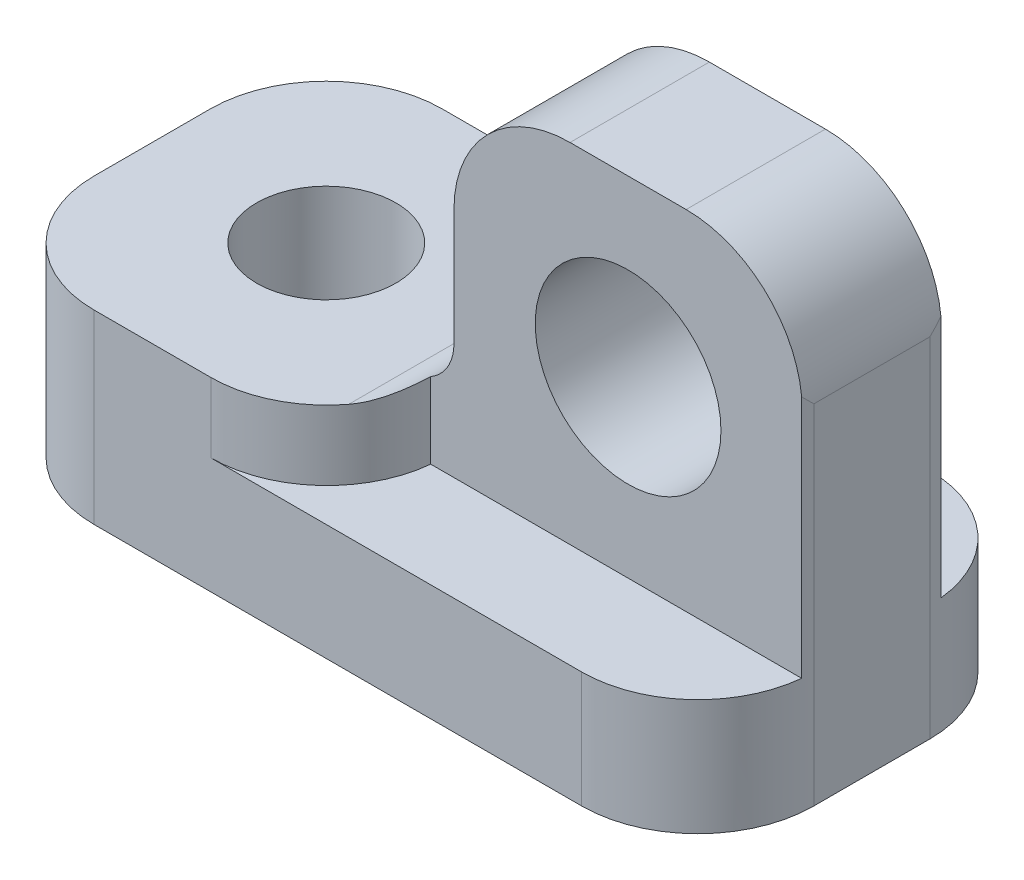
ISO-10303-21;
HEADER;
FILE_DESCRIPTION(('STEP AP214'),'2;1');
FILE_NAME('part.step','',(''),(''),'','','');
FILE_SCHEMA(('AUTOMOTIVE_DESIGN { 1 0 10303 214 1 1 1 1 }'));
ENDSEC;
DATA;
#1=APPLICATION_CONTEXT('core data for automotive mechanical design processes');
#2=APPLICATION_PROTOCOL_DEFINITION('international standard','automotive_design',2000,#1);
#3=PRODUCT_CONTEXT('',#1,'mechanical');
#4=PRODUCT('Part','Part','',(#3));
#5=PRODUCT_RELATED_PRODUCT_CATEGORY('part','',(#4));
#6=PRODUCT_DEFINITION_FORMATION('','',#4);
#7=PRODUCT_DEFINITION_CONTEXT('part definition',#1,'design');
#8=PRODUCT_DEFINITION('design','',#6,#7);
#9=PRODUCT_DEFINITION_SHAPE('','',#8);
#10=(LENGTH_UNIT() NAMED_UNIT(*) SI_UNIT(.MILLI.,.METRE.));
#11=(NAMED_UNIT(*) PLANE_ANGLE_UNIT() SI_UNIT($,.RADIAN.));
#12=(NAMED_UNIT(*) SI_UNIT($,.STERADIAN.) SOLID_ANGLE_UNIT());
#13=UNCERTAINTY_MEASURE_WITH_UNIT(LENGTH_MEASURE(1.E-05),#10,'distance_accuracy_value','');
#14=(GEOMETRIC_REPRESENTATION_CONTEXT(3) GLOBAL_UNCERTAINTY_ASSIGNED_CONTEXT((#13)) GLOBAL_UNIT_ASSIGNED_CONTEXT((#10,
#11,#12)) REPRESENTATION_CONTEXT('',''));
#15=CARTESIAN_POINT('',(0.,0.,0.));
#16=DIRECTION('',(0.,0.,1.));
#17=DIRECTION('',(1.,0.,0.));
#18=AXIS2_PLACEMENT_3D('',#15,#16,#17);
#19=CARTESIAN_POINT('',(0.,5.,0.));
#20=DIRECTION('',(0.,-1.,0.));
#21=DIRECTION('',(0.,0.,-1.));
#22=AXIS2_PLACEMENT_3D('',#19,#20,#21);
#23=PLANE('',#22);
#24=DIRECTION('',(-1.,0.,0.));
#25=VECTOR('',#24,1.);
#26=CARTESIAN_POINT('',(16.,5.,-10.5));
#27=LINE('',#26,#25);
#28=CARTESIAN_POINT('',(30.9749371855331,5.,-10.5));
#29=VERTEX_POINT('',#28);
#30=CARTESIAN_POINT('',(15.,5.,-10.5));
#31=VERTEX_POINT('',#30);
#32=EDGE_CURVE('E187',#29,#31,#27,.T.);
#33=ORIENTED_EDGE('',*,*,#32,.F.);
#34=CARTESIAN_POINT('',(26.,5.,-10.));
#35=DIRECTION('',(0.,-1.,0.));
#36=DIRECTION('',(0.,0.,-1.));
#37=AXIS2_PLACEMENT_3D('',#34,#35,#36);
#38=CIRCLE('',#37,5.);
#39=CARTESIAN_POINT('',(26.,5.,-15.));
#40=VERTEX_POINT('',#39);
#41=EDGE_CURVE('E283',#29,#40,#38,.F.);
#42=ORIENTED_EDGE('',*,*,#41,.T.);
#43=DIRECTION('',(-1.,0.,0.));
#44=VECTOR('',#43,1.);
#45=CARTESIAN_POINT('',(0.,5.,-15.));
#46=LINE('',#45,#44);
#47=CARTESIAN_POINT('',(10.0250628144669,5.,-15.));
#48=VERTEX_POINT('',#47);
#49=EDGE_CURVE('E231',#40,#48,#46,.T.);
#50=ORIENTED_EDGE('',*,*,#49,.T.);
#51=CARTESIAN_POINT('',(10.0250628144669,5.,-10.));
#52=DIRECTION('',(0.,-1.,0.));
#53=DIRECTION('',(0.,0.,-1.));
#54=AXIS2_PLACEMENT_3D('',#51,#52,#53);
#55=CIRCLE('',#54,5.);
#56=EDGE_CURVE('E178',#48,#31,#55,.T.);
#57=ORIENTED_EDGE('',*,*,#56,.T.);
#58=EDGE_LOOP('',(#33,#42,#50,#57));
#59=FACE_BOUND('',#58,.T.);
#60=ADVANCED_FACE('F35',(#59),#23,.F.);
#61=DIRECTION('',(1.,0.,0.));
#62=VECTOR('',#61,1.);
#63=CARTESIAN_POINT('',(0.,5.,0.));
#64=LINE('',#63,#62);
#65=CARTESIAN_POINT('',(10.0250628144669,5.,0.));
#66=VERTEX_POINT('',#65);
#67=CARTESIAN_POINT('',(26.,5.,0.));
#68=VERTEX_POINT('',#67);
#69=EDGE_CURVE('E229',#66,#68,#64,.T.);
#70=ORIENTED_EDGE('',*,*,#69,.T.);
#71=CARTESIAN_POINT('',(26.,5.,-5.));
#72=DIRECTION('',(0.,-1.,0.));
#73=DIRECTION('',(0.,0.,-1.));
#74=AXIS2_PLACEMENT_3D('',#71,#72,#73);
#75=CIRCLE('',#74,5.);
#76=CARTESIAN_POINT('',(30.9749371855331,5.,-4.5));
#77=VERTEX_POINT('',#76);
#78=EDGE_CURVE('E184',#68,#77,#75,.F.);
#79=ORIENTED_EDGE('',*,*,#78,.T.);
#80=DIRECTION('',(1.,0.,0.));
#81=VECTOR('',#80,1.);
#82=CARTESIAN_POINT('',(16.,5.,-4.5));
#83=LINE('',#82,#81);
#84=CARTESIAN_POINT('',(15.,5.,-4.5));
#85=VERTEX_POINT('',#84);
#86=EDGE_CURVE('E181',#85,#77,#83,.T.);
#87=ORIENTED_EDGE('',*,*,#86,.F.);
#88=CARTESIAN_POINT('',(10.0250628144669,5.,-5.));
#89=DIRECTION('',(0.,-1.,0.));
#90=DIRECTION('',(0.,0.,-1.));
#91=AXIS2_PLACEMENT_3D('',#88,#89,#90);
#92=CIRCLE('',#91,5.);
#93=EDGE_CURVE('E170',#85,#66,#92,.T.);
#94=ORIENTED_EDGE('',*,*,#93,.T.);
#95=EDGE_LOOP('',(#70,#79,#87,#94));
#96=FACE_BOUND('',#95,.T.);
#97=ADVANCED_FACE('F182',(#96),#23,.F.);
#98=CARTESIAN_POINT('',(16.,20.,-10.5));
#99=DIRECTION('',(1.,0.,0.));
#100=DIRECTION('',(0.,0.,-1.));
#101=AXIS2_PLACEMENT_3D('',#98,#99,#100);
#102=PLANE('',#101);
#103=DIRECTION('',(0.,-1.,0.));
#104=VECTOR('',#103,1.);
#105=CARTESIAN_POINT('',(16.,20.,-10.5));
#106=LINE('',#105,#104);
#107=CARTESIAN_POINT('',(16.,15.,-10.5));
#108=VERTEX_POINT('',#107);
#109=CARTESIAN_POINT('',(16.,10.,-10.5));
#110=VERTEX_POINT('',#109);
#111=EDGE_CURVE('E207',#108,#110,#106,.T.);
#112=ORIENTED_EDGE('',*,*,#111,.T.);
#113=DIRECTION('',(0.,0.,-1.));
#114=VECTOR('',#113,1.);
#115=CARTESIAN_POINT('',(16.,10.,-10.5));
#116=LINE('',#115,#114);
#117=CARTESIAN_POINT('',(16.,10.,-4.5));
#118=VERTEX_POINT('',#117);
#119=EDGE_CURVE('E311',#110,#118,#116,.F.);
#120=ORIENTED_EDGE('',*,*,#119,.T.);
#121=DIRECTION('',(0.,-1.,0.));
#122=VECTOR('',#121,1.);
#123=CARTESIAN_POINT('',(16.,20.,-4.5));
#124=LINE('',#123,#122);
#125=CARTESIAN_POINT('',(16.,15.,-4.5));
#126=VERTEX_POINT('',#125);
#127=EDGE_CURVE('E212',#126,#118,#124,.T.);
#128=ORIENTED_EDGE('',*,*,#127,.F.);
#129=DIRECTION('',(0.,0.,1.));
#130=VECTOR('',#129,1.);
#131=CARTESIAN_POINT('',(16.,15.,-10.5));
#132=LINE('',#131,#130);
#133=EDGE_CURVE('E253',#126,#108,#132,.F.);
#134=ORIENTED_EDGE('',*,*,#133,.T.);
#135=EDGE_LOOP('',(#112,#120,#128,#134));
#136=FACE_BOUND('',#135,.T.);
#137=ADVANCED_FACE('F347',(#136),#102,.F.);
#138=CARTESIAN_POINT('',(0.,5.,0.));
#139=DIRECTION('',(1.,0.,0.));
#140=DIRECTION('',(0.,0.,-1.));
#141=AXIS2_PLACEMENT_3D('',#138,#139,#140);
#142=PLANE('',#141);
#143=DIRECTION('',(0.,0.,1.));
#144=VECTOR('',#143,1.);
#145=CARTESIAN_POINT('',(0.,0.,0.));
#146=LINE('',#145,#144);
#147=CARTESIAN_POINT('',(0.,0.,-10.));
#148=VERTEX_POINT('',#147);
#149=CARTESIAN_POINT('',(0.,0.,-5.));
#150=VERTEX_POINT('',#149);
#151=EDGE_CURVE('E223',#148,#150,#146,.T.);
#152=ORIENTED_EDGE('',*,*,#151,.T.);
#153=DIRECTION('',(0.,-1.,0.));
#154=VECTOR('',#153,1.);
#155=CARTESIAN_POINT('',(0.,5.,-5.));
#156=LINE('',#155,#154);
#157=CARTESIAN_POINT('',(0.,8.,-5.));
#158=VERTEX_POINT('',#157);
#159=EDGE_CURVE('E306',#150,#158,#156,.F.);
#160=ORIENTED_EDGE('',*,*,#159,.T.);
#161=DIRECTION('',(0.,0.,1.));
#162=VECTOR('',#161,1.);
#163=CARTESIAN_POINT('',(0.,8.,-15.));
#164=LINE('',#163,#162);
#165=CARTESIAN_POINT('',(0.,8.,-10.));
#166=VERTEX_POINT('',#165);
#167=EDGE_CURVE('E214',#166,#158,#164,.T.);
#168=ORIENTED_EDGE('',*,*,#167,.F.);
#169=DIRECTION('',(0.,-1.,0.));
#170=VECTOR('',#169,1.);
#171=CARTESIAN_POINT('',(0.,5.,-10.));
#172=LINE('',#171,#170);
#173=EDGE_CURVE('E303',#166,#148,#172,.T.);
#174=ORIENTED_EDGE('',*,*,#173,.T.);
#175=EDGE_LOOP('',(#152,#160,#168,#174));
#176=FACE_BOUND('',#175,.T.);
#177=ADVANCED_FACE('F368',(#176),#142,.F.);
#178=CARTESIAN_POINT('',(0.,5.,0.));
#179=DIRECTION('',(0.,0.,-1.));
#180=DIRECTION('',(-1.,0.,0.));
#181=AXIS2_PLACEMENT_3D('',#178,#179,#180);
#182=PLANE('',#181);
#183=DIRECTION('',(1.,0.,0.));
#184=VECTOR('',#183,1.);
#185=CARTESIAN_POINT('',(0.,0.,0.));
#186=LINE('',#185,#184);
#187=CARTESIAN_POINT('',(5.,0.,0.));
#188=VERTEX_POINT('',#187);
#189=CARTESIAN_POINT('',(26.,0.,0.));
#190=VERTEX_POINT('',#189);
#191=EDGE_CURVE('E419',#188,#190,#186,.T.);
#192=ORIENTED_EDGE('',*,*,#191,.T.);
#193=DIRECTION('',(0.,-1.,0.));
#194=VECTOR('',#193,1.);
#195=CARTESIAN_POINT('',(26.,5.,0.));
#196=LINE('',#195,#194);
#197=EDGE_CURVE('E289',#190,#68,#196,.F.);
#198=ORIENTED_EDGE('',*,*,#197,.T.);
#199=ORIENTED_EDGE('',*,*,#69,.F.);
#200=DIRECTION('',(0.,-1.,0.));
#201=VECTOR('',#200,1.);
#202=CARTESIAN_POINT('',(10.0250628144669,5.,0.));
#203=LINE('',#202,#201);
#204=CARTESIAN_POINT('',(10.0250628144669,8.,0.));
#205=VERTEX_POINT('',#204);
#206=EDGE_CURVE('E174',#66,#205,#203,.F.);
#207=ORIENTED_EDGE('',*,*,#206,.T.);
#208=DIRECTION('',(1.,0.,0.));
#209=VECTOR('',#208,1.);
#210=CARTESIAN_POINT('',(0.,8.,0.));
#211=LINE('',#210,#209);
#212=CARTESIAN_POINT('',(5.,8.,0.));
#213=VERTEX_POINT('',#212);
#214=EDGE_CURVE('E217',#213,#205,#211,.T.);
#215=ORIENTED_EDGE('',*,*,#214,.F.);
#216=DIRECTION('',(0.,-1.,0.));
#217=VECTOR('',#216,1.);
#218=CARTESIAN_POINT('',(5.,5.,0.));
#219=LINE('',#218,#217);
#220=EDGE_CURVE('E285',#213,#188,#219,.T.);
#221=ORIENTED_EDGE('',*,*,#220,.T.);
#222=EDGE_LOOP('',(#192,#198,#199,#207,#215,#221));
#223=FACE_BOUND('',#222,.T.);
#224=ADVANCED_FACE('F364',(#223),#182,.F.);
#225=CARTESIAN_POINT('',(31.,5.,0.));
#226=DIRECTION('',(-1.,0.,0.));
#227=DIRECTION('',(0.,0.,1.));
#228=AXIS2_PLACEMENT_3D('',#225,#226,#227);
#229=PLANE('',#228);
#230=DIRECTION('',(0.,0.,-1.));
#231=VECTOR('',#230,1.);
#232=CARTESIAN_POINT('',(31.,0.,0.));
#233=LINE('',#232,#231);
#234=CARTESIAN_POINT('',(31.,0.,-5.));
#235=VERTEX_POINT('',#234);
#236=CARTESIAN_POINT('',(31.,0.,-10.));
#237=VERTEX_POINT('',#236);
#238=EDGE_CURVE('E422',#235,#237,#233,.T.);
#239=ORIENTED_EDGE('',*,*,#238,.T.);
#240=DIRECTION('',(0.,-1.,0.));
#241=VECTOR('',#240,1.);
#242=CARTESIAN_POINT('',(31.,5.,-10.));
#243=LINE('',#242,#241);
#244=CARTESIAN_POINT('',(31.,15.,-10.));
#245=VERTEX_POINT('',#244);
#246=EDGE_CURVE('E275',#237,#245,#243,.F.);
#247=ORIENTED_EDGE('',*,*,#246,.T.);
#248=DIRECTION('',(0.,0.,-1.));
#249=VECTOR('',#248,1.);
#250=CARTESIAN_POINT('',(31.,15.,-4.5));
#251=LINE('',#250,#249);
#252=CARTESIAN_POINT('',(31.,15.,-5.));
#253=VERTEX_POINT('',#252);
#254=EDGE_CURVE('E246',#245,#253,#251,.F.);
#255=ORIENTED_EDGE('',*,*,#254,.T.);
#256=DIRECTION('',(0.,-1.,0.));
#257=VECTOR('',#256,1.);
#258=CARTESIAN_POINT('',(31.,5.,-5.));
#259=LINE('',#258,#257);
#260=EDGE_CURVE('E272',#253,#235,#259,.T.);
#261=ORIENTED_EDGE('',*,*,#260,.T.);
#262=EDGE_LOOP('',(#239,#247,#255,#261));
#263=FACE_BOUND('',#262,.T.);
#264=ADVANCED_FACE('F360',(#263),#229,.F.);
#265=CARTESIAN_POINT('',(0.,5.,-15.));
#266=DIRECTION('',(0.,0.,1.));
#267=DIRECTION('',(1.,0.,0.));
#268=AXIS2_PLACEMENT_3D('',#265,#266,#267);
#269=PLANE('',#268);
#270=ORIENTED_EDGE('',*,*,#49,.F.);
#271=DIRECTION('',(0.,-1.,0.));
#272=VECTOR('',#271,1.);
#273=CARTESIAN_POINT('',(26.,5.,-15.));
#274=LINE('',#273,#272);
#275=CARTESIAN_POINT('',(26.,0.,-15.));
#276=VERTEX_POINT('',#275);
#277=EDGE_CURVE('E261',#40,#276,#274,.T.);
#278=ORIENTED_EDGE('',*,*,#277,.T.);
#279=DIRECTION('',(-1.,0.,0.));
#280=VECTOR('',#279,1.);
#281=CARTESIAN_POINT('',(0.,0.,-15.));
#282=LINE('',#281,#280);
#283=CARTESIAN_POINT('',(5.,0.,-15.));
#284=VERTEX_POINT('',#283);
#285=EDGE_CURVE('E232',#276,#284,#282,.T.);
#286=ORIENTED_EDGE('',*,*,#285,.T.);
#287=DIRECTION('',(0.,-1.,0.));
#288=VECTOR('',#287,1.);
#289=CARTESIAN_POINT('',(5.,5.,-15.));
#290=LINE('',#289,#288);
#291=CARTESIAN_POINT('',(5.,8.,-15.));
#292=VERTEX_POINT('',#291);
#293=EDGE_CURVE('E255',#284,#292,#290,.F.);
#294=ORIENTED_EDGE('',*,*,#293,.T.);
#295=DIRECTION('',(-1.,0.,0.));
#296=VECTOR('',#295,1.);
#297=CARTESIAN_POINT('',(0.,8.,-15.));
#298=LINE('',#297,#296);
#299=CARTESIAN_POINT('',(10.0250628144669,8.,-15.));
#300=VERTEX_POINT('',#299);
#301=EDGE_CURVE('E220',#300,#292,#298,.T.);
#302=ORIENTED_EDGE('',*,*,#301,.F.);
#303=DIRECTION('',(0.,1.,0.));
#304=VECTOR('',#303,1.);
#305=CARTESIAN_POINT('',(10.0250628144669,5.,-15.));
#306=LINE('',#305,#304);
#307=EDGE_CURVE('E258',#300,#48,#306,.F.);
#308=ORIENTED_EDGE('',*,*,#307,.T.);
#309=EDGE_LOOP('',(#270,#278,#286,#294,#302,#308));
#310=FACE_BOUND('',#309,.T.);
#311=ADVANCED_FACE('F356',(#310),#269,.F.);
#312=CARTESIAN_POINT('',(0.,0.,0.));
#313=DIRECTION('',(0.,-1.,0.));
#314=DIRECTION('',(0.,0.,-1.));
#315=AXIS2_PLACEMENT_3D('',#312,#313,#314);
#316=PLANE('',#315);
#317=ORIENTED_EDGE('',*,*,#285,.F.);
#318=CARTESIAN_POINT('',(26.,0.,-10.));
#319=DIRECTION('',(0.,-1.,0.));
#320=DIRECTION('',(0.,0.,-1.));
#321=AXIS2_PLACEMENT_3D('',#318,#319,#320);
#322=CIRCLE('',#321,5.);
#323=EDGE_CURVE('E270',#276,#237,#322,.T.);
#324=ORIENTED_EDGE('',*,*,#323,.T.);
#325=ORIENTED_EDGE('',*,*,#238,.F.);
#326=CARTESIAN_POINT('',(26.,0.,-5.));
#327=DIRECTION('',(0.,-1.,0.));
#328=DIRECTION('',(0.,0.,-1.));
#329=AXIS2_PLACEMENT_3D('',#326,#327,#328);
#330=CIRCLE('',#329,5.);
#331=EDGE_CURVE('E268',#235,#190,#330,.T.);
#332=ORIENTED_EDGE('',*,*,#331,.T.);
#333=ORIENTED_EDGE('',*,*,#191,.F.);
#334=CARTESIAN_POINT('',(5.,0.,-5.));
#335=DIRECTION('',(0.,-1.,0.));
#336=DIRECTION('',(0.,0.,-1.));
#337=AXIS2_PLACEMENT_3D('',#334,#335,#336);
#338=CIRCLE('',#337,5.);
#339=EDGE_CURVE('E266',#188,#150,#338,.T.);
#340=ORIENTED_EDGE('',*,*,#339,.T.);
#341=ORIENTED_EDGE('',*,*,#151,.F.);
#342=CARTESIAN_POINT('',(5.,0.,-10.));
#343=DIRECTION('',(0.,-1.,0.));
#344=DIRECTION('',(0.,0.,-1.));
#345=AXIS2_PLACEMENT_3D('',#342,#343,#344);
#346=CIRCLE('',#345,5.);
#347=EDGE_CURVE('E264',#148,#284,#346,.T.);
#348=ORIENTED_EDGE('',*,*,#347,.T.);
#349=EDGE_LOOP('',(#317,#324,#325,#332,#333,#340,#341,#348));
#350=FACE_BOUND('',#349,.T.);
#351=ADVANCED_FACE('F353',(#350),#316,.T.);
#352=CARTESIAN_POINT('',(0.,8.,0.));
#353=DIRECTION('',(0.,1.,0.));
#354=DIRECTION('',(0.,0.,1.));
#355=AXIS2_PLACEMENT_3D('',#352,#353,#354);
#356=PLANE('',#355);
#357=CARTESIAN_POINT('',(7.5,8.,-7.5));
#358=DIRECTION('',(0.,1.,0.));
#359=DIRECTION('',(0.,0.,1.));
#360=AXIS2_PLACEMENT_3D('',#357,#358,#359);
#361=CIRCLE('',#360,3.);
#362=CARTESIAN_POINT('',(7.5,8.,-4.5));
#363=VERTEX_POINT('',#362);
#364=EDGE_CURVE('E446',#363,#363,#361,.T.);
#365=ORIENTED_EDGE('',*,*,#364,.F.);
#366=EDGE_LOOP('',(#365));
#367=FACE_BOUND('',#366,.T.);
#368=CARTESIAN_POINT('',(10.0250628144669,8.,-5.));
#369=DIRECTION('',(0.,1.,0.));
#370=DIRECTION('',(0.,0.,1.));
#371=AXIS2_PLACEMENT_3D('',#368,#369,#370);
#372=CIRCLE('',#371,5.);
#373=CARTESIAN_POINT('',(14.,8.,-1.96687053176653));
#374=VERTEX_POINT('',#373);
#375=EDGE_CURVE('E298',#205,#374,#372,.T.);
#376=ORIENTED_EDGE('',*,*,#375,.T.);
#377=DIRECTION('',(0.,0.,-1.));
#378=VECTOR('',#377,1.);
#379=CARTESIAN_POINT('',(14.,8.,0.));
#380=LINE('',#379,#378);
#381=CARTESIAN_POINT('',(14.,8.,-13.0331294682335));
#382=VERTEX_POINT('',#381);
#383=EDGE_CURVE('E177',#374,#382,#380,.T.);
#384=ORIENTED_EDGE('',*,*,#383,.T.);
#385=CARTESIAN_POINT('',(10.0250628144669,8.,-10.));
#386=DIRECTION('',(0.,1.,0.));
#387=DIRECTION('',(0.,0.,1.));
#388=AXIS2_PLACEMENT_3D('',#385,#386,#387);
#389=CIRCLE('',#388,5.);
#390=EDGE_CURVE('E301',#382,#300,#389,.T.);
#391=ORIENTED_EDGE('',*,*,#390,.T.);
#392=ORIENTED_EDGE('',*,*,#301,.T.);
#393=CARTESIAN_POINT('',(5.,8.,-10.));
#394=DIRECTION('',(0.,1.,0.));
#395=DIRECTION('',(0.,0.,1.));
#396=AXIS2_PLACEMENT_3D('',#393,#394,#395);
#397=CIRCLE('',#396,5.);
#398=EDGE_CURVE('E294',#292,#166,#397,.T.);
#399=ORIENTED_EDGE('',*,*,#398,.T.);
#400=ORIENTED_EDGE('',*,*,#167,.T.);
#401=CARTESIAN_POINT('',(5.,8.,-5.));
#402=DIRECTION('',(0.,1.,0.));
#403=DIRECTION('',(0.,0.,1.));
#404=AXIS2_PLACEMENT_3D('',#401,#402,#403);
#405=CIRCLE('',#404,5.);
#406=EDGE_CURVE('E296',#158,#213,#405,.T.);
#407=ORIENTED_EDGE('',*,*,#406,.T.);
#408=ORIENTED_EDGE('',*,*,#214,.T.);
#409=EDGE_LOOP('',(#376,#384,#391,#392,#399,#400,#407,#408));
#410=FACE_BOUND('',#409,.T.);
#411=ADVANCED_FACE('F351',(#367,#410),#356,.T.);
#412=CARTESIAN_POINT('',(16.,20.,-4.5));
#413=DIRECTION('',(0.,0.,-1.));
#414=DIRECTION('',(-1.,0.,0.));
#415=AXIS2_PLACEMENT_3D('',#412,#413,#414);
#416=PLANE('',#415);
#417=CARTESIAN_POINT('',(23.5,12.5,-4.5));
#418=DIRECTION('',(0.,0.,1.));
#419=DIRECTION('',(1.,0.,0.));
#420=AXIS2_PLACEMENT_3D('',#417,#418,#419);
#421=CIRCLE('',#420,4.00000000000001);
#422=CARTESIAN_POINT('',(27.5,12.5,-4.5));
#423=VERTEX_POINT('',#422);
#424=EDGE_CURVE('E197',#423,#423,#421,.T.);
#425=ORIENTED_EDGE('',*,*,#424,.F.);
#426=EDGE_LOOP('',(#425));
#427=FACE_BOUND('',#426,.T.);
#428=ORIENTED_EDGE('',*,*,#86,.T.);
#429=DIRECTION('',(0.,-1.,0.));
#430=VECTOR('',#429,1.);
#431=CARTESIAN_POINT('',(30.9749371855331,5.,-4.5));
#432=LINE('',#431,#430);
#433=CARTESIAN_POINT('',(30.9749371855331,15.5,-4.5));
#434=VERTEX_POINT('',#433);
#435=EDGE_CURVE('E292',#77,#434,#432,.F.);
#436=ORIENTED_EDGE('',*,*,#435,.T.);
#437=CARTESIAN_POINT('',(26.,15.,-4.5));
#438=DIRECTION('',(0.,0.,-1.));
#439=DIRECTION('',(-1.,0.,0.));
#440=AXIS2_PLACEMENT_3D('',#437,#438,#439);
#441=CIRCLE('',#440,5.);
#442=CARTESIAN_POINT('',(26.,20.,-4.5));
#443=VERTEX_POINT('',#442);
#444=EDGE_CURVE('E251',#434,#443,#441,.F.);
#445=ORIENTED_EDGE('',*,*,#444,.T.);
#446=DIRECTION('',(1.,0.,0.));
#447=VECTOR('',#446,1.);
#448=CARTESIAN_POINT('',(16.,20.,-4.5));
#449=LINE('',#448,#447);
#450=CARTESIAN_POINT('',(21.,20.,-4.5));
#451=VERTEX_POINT('',#450);
#452=EDGE_CURVE('E202',#451,#443,#449,.T.);
#453=ORIENTED_EDGE('',*,*,#452,.F.);
#454=CARTESIAN_POINT('',(21.,15.,-4.5));
#455=DIRECTION('',(0.,0.,-1.));
#456=DIRECTION('',(-1.,0.,0.));
#457=AXIS2_PLACEMENT_3D('',#454,#455,#456);
#458=CIRCLE('',#457,5.);
#459=EDGE_CURVE('E249',#451,#126,#458,.F.);
#460=ORIENTED_EDGE('',*,*,#459,.T.);
#461=ORIENTED_EDGE('',*,*,#127,.T.);
#462=CARTESIAN_POINT('',(14.,10.,-4.5));
#463=DIRECTION('',(0.,0.,-1.));
#464=DIRECTION('',(-1.,0.,0.));
#465=AXIS2_PLACEMENT_3D('',#462,#463,#464);
#466=CIRCLE('',#465,2.);
#467=CARTESIAN_POINT('',(15.,8.26794919243113,-4.49999999999999));
#468=VERTEX_POINT('',#467);
#469=EDGE_CURVE('E48',#118,#468,#466,.T.);
#470=ORIENTED_EDGE('',*,*,#469,.T.);
#471=DIRECTION('',(0.,-1.,0.));
#472=VECTOR('',#471,1.);
#473=CARTESIAN_POINT('',(15.,8.,-4.49999999999999));
#474=LINE('',#473,#472);
#475=EDGE_CURVE('E54',#468,#85,#474,.T.);
#476=ORIENTED_EDGE('',*,*,#475,.T.);
#477=EDGE_LOOP('',(#428,#436,#445,#453,#460,#461,#470,#476));
#478=FACE_BOUND('',#477,.T.);
#479=ADVANCED_FACE('F189',(#427,#478),#416,.F.);
#480=CARTESIAN_POINT('',(16.,20.,-10.5));
#481=DIRECTION('',(0.,0.,1.));
#482=DIRECTION('',(1.,0.,0.));
#483=AXIS2_PLACEMENT_3D('',#480,#481,#482);
#484=PLANE('',#483);
#485=CARTESIAN_POINT('',(23.5,12.5,-10.5));
#486=DIRECTION('',(0.,0.,1.));
#487=DIRECTION('',(1.,0.,0.));
#488=AXIS2_PLACEMENT_3D('',#485,#486,#487);
#489=CIRCLE('',#488,4.00000000000001);
#490=CARTESIAN_POINT('',(27.5,12.5,-10.5));
#491=VERTEX_POINT('',#490);
#492=EDGE_CURVE('E193',#491,#491,#489,.T.);
#493=ORIENTED_EDGE('',*,*,#492,.T.);
#494=EDGE_LOOP('',(#493));
#495=FACE_BOUND('',#494,.T.);
#496=CARTESIAN_POINT('',(26.,15.,-10.5));
#497=DIRECTION('',(0.,0.,1.));
#498=DIRECTION('',(1.,0.,0.));
#499=AXIS2_PLACEMENT_3D('',#496,#497,#498);
#500=CIRCLE('',#499,5.);
#501=CARTESIAN_POINT('',(26.,20.,-10.5));
#502=VERTEX_POINT('',#501);
#503=CARTESIAN_POINT('',(30.9749371855331,15.5,-10.5));
#504=VERTEX_POINT('',#503);
#505=EDGE_CURVE('E243',#502,#504,#500,.F.);
#506=ORIENTED_EDGE('',*,*,#505,.T.);
#507=DIRECTION('',(0.,-1.,0.));
#508=VECTOR('',#507,1.);
#509=CARTESIAN_POINT('',(30.9749371855331,15.5,-10.5));
#510=LINE('',#509,#508);
#511=EDGE_CURVE('E281',#504,#29,#510,.T.);
#512=ORIENTED_EDGE('',*,*,#511,.T.);
#513=ORIENTED_EDGE('',*,*,#32,.T.);
#514=DIRECTION('',(0.,-1.,0.));
#515=VECTOR('',#514,1.);
#516=CARTESIAN_POINT('',(15.,8.,-10.5));
#517=LINE('',#516,#515);
#518=CARTESIAN_POINT('',(15.,8.26794919243113,-10.5));
#519=VERTEX_POINT('',#518);
#520=EDGE_CURVE('E62',#519,#31,#517,.T.);
#521=ORIENTED_EDGE('',*,*,#520,.F.);
#522=CARTESIAN_POINT('',(14.,10.,-10.5));
#523=DIRECTION('',(0.,0.,1.));
#524=DIRECTION('',(1.,0.,0.));
#525=AXIS2_PLACEMENT_3D('',#522,#523,#524);
#526=CIRCLE('',#525,2.);
#527=EDGE_CURVE('E319',#519,#110,#526,.T.);
#528=ORIENTED_EDGE('',*,*,#527,.T.);
#529=ORIENTED_EDGE('',*,*,#111,.F.);
#530=CARTESIAN_POINT('',(21.,15.,-10.5));
#531=DIRECTION('',(0.,0.,1.));
#532=DIRECTION('',(1.,0.,0.));
#533=AXIS2_PLACEMENT_3D('',#530,#531,#532);
#534=CIRCLE('',#533,5.);
#535=CARTESIAN_POINT('',(21.,20.,-10.5));
#536=VERTEX_POINT('',#535);
#537=EDGE_CURVE('E241',#108,#536,#534,.F.);
#538=ORIENTED_EDGE('',*,*,#537,.T.);
#539=DIRECTION('',(-1.,0.,0.));
#540=VECTOR('',#539,1.);
#541=CARTESIAN_POINT('',(16.,20.,-10.5));
#542=LINE('',#541,#540);
#543=EDGE_CURVE('E205',#502,#536,#542,.T.);
#544=ORIENTED_EDGE('',*,*,#543,.F.);
#545=EDGE_LOOP('',(#506,#512,#513,#521,#528,#529,#538,#544));
#546=FACE_BOUND('',#545,.T.);
#547=ADVANCED_FACE('F395',(#495,#546),#484,.F.);
#548=CARTESIAN_POINT('',(0.,20.,0.));
#549=DIRECTION('',(0.,1.,0.));
#550=DIRECTION('',(0.,0.,1.));
#551=AXIS2_PLACEMENT_3D('',#548,#549,#550);
#552=PLANE('',#551);
#553=ORIENTED_EDGE('',*,*,#452,.T.);
#554=DIRECTION('',(0.,0.,-1.));
#555=VECTOR('',#554,1.);
#556=CARTESIAN_POINT('',(26.,20.,-10.5));
#557=LINE('',#556,#555);
#558=EDGE_CURVE('E238',#443,#502,#557,.T.);
#559=ORIENTED_EDGE('',*,*,#558,.T.);
#560=ORIENTED_EDGE('',*,*,#543,.T.);
#561=DIRECTION('',(0.,0.,1.));
#562=VECTOR('',#561,1.);
#563=CARTESIAN_POINT('',(21.,20.,-4.5));
#564=LINE('',#563,#562);
#565=EDGE_CURVE('E235',#536,#451,#564,.T.);
#566=ORIENTED_EDGE('',*,*,#565,.T.);
#567=EDGE_LOOP('',(#553,#559,#560,#566));
#568=FACE_BOUND('',#567,.T.);
#569=ADVANCED_FACE('F400',(#568),#552,.T.);
#570=CARTESIAN_POINT('',(23.5,12.5,-15.00005));
#571=DIRECTION('',(0.,0.,1.));
#572=DIRECTION('',(1.,0.,0.));
#573=AXIS2_PLACEMENT_3D('',#570,#571,#572);
#574=CYLINDRICAL_SURFACE('',#573,4.00000000000001);
#575=ORIENTED_EDGE('',*,*,#424,.T.);
#576=EDGE_LOOP('',(#575));
#577=FACE_BOUND('',#576,.T.);
#578=ORIENTED_EDGE('',*,*,#492,.F.);
#579=EDGE_LOOP('',(#578));
#580=FACE_BOUND('',#579,.T.);
#581=ADVANCED_FACE('F456',(#577,#580),#574,.F.);
#582=CARTESIAN_POINT('',(0.,0.2,0.));
#583=DIRECTION('',(0.,-1.,0.));
#584=DIRECTION('',(0.,0.,-1.));
#585=AXIS2_PLACEMENT_3D('',#582,#583,#584);
#586=PLANE('',#585);
#587=CARTESIAN_POINT('',(7.5,0.200000000000001,-7.5));
#588=DIRECTION('',(0.,-1.,0.));
#589=DIRECTION('',(0.,0.,-1.));
#590=AXIS2_PLACEMENT_3D('',#587,#588,#589);
#591=CIRCLE('',#590,3.);
#592=CARTESIAN_POINT('',(7.5,0.200000000000001,-10.5));
#593=VERTEX_POINT('',#592);
#594=EDGE_CURVE('E448',#593,#593,#591,.F.);
#595=ORIENTED_EDGE('',*,*,#594,.T.);
#596=EDGE_LOOP('',(#595));
#597=FACE_BOUND('',#596,.T.);
#598=ADVANCED_FACE('F459',(#597),#586,.F.);
#599=CARTESIAN_POINT('',(7.5,-8.48528137423857,-7.5));
#600=DIRECTION('',(0.,1.,0.));
#601=DIRECTION('',(0.,0.,1.));
#602=AXIS2_PLACEMENT_3D('',#599,#600,#601);
#603=CYLINDRICAL_SURFACE('',#602,3.);
#604=ORIENTED_EDGE('',*,*,#364,.T.);
#605=EDGE_LOOP('',(#604));
#606=FACE_BOUND('',#605,.T.);
#607=ORIENTED_EDGE('',*,*,#594,.F.);
#608=EDGE_LOOP('',(#607));
#609=FACE_BOUND('',#608,.T.);
#610=ADVANCED_FACE('F377',(#606,#609),#603,.F.);
#611=CARTESIAN_POINT('',(26.,15.,0.));
#612=DIRECTION('',(0.,0.,1.));
#613=DIRECTION('',(1.,0.,0.));
#614=AXIS2_PLACEMENT_3D('',#611,#612,#613);
#615=CYLINDRICAL_SURFACE('',#614,5.);
#616=ORIENTED_EDGE('',*,*,#254,.F.);
#617=CARTESIAN_POINT('',(26.,15.,-10.));
#618=DIRECTION('',(0.,0.707106781186547,0.707106781186547));
#619=DIRECTION('',(0.,-0.707106781186547,0.707106781186547));
#620=AXIS2_PLACEMENT_3D('',#617,#618,#619);
#621=ELLIPSE('',#620,7.07106781186547,5.);
#622=EDGE_CURVE('E279',#245,#504,#621,.T.);
#623=ORIENTED_EDGE('',*,*,#622,.T.);
#624=ORIENTED_EDGE('',*,*,#505,.F.);
#625=ORIENTED_EDGE('',*,*,#558,.F.);
#626=ORIENTED_EDGE('',*,*,#444,.F.);
#627=CARTESIAN_POINT('',(26.,15.,-5.));
#628=DIRECTION('',(0.,-0.707106781186547,0.707106781186547));
#629=DIRECTION('',(0.,0.707106781186547,0.707106781186547));
#630=AXIS2_PLACEMENT_3D('',#627,#628,#629);
#631=ELLIPSE('',#630,7.07106781186547,5.);
#632=EDGE_CURVE('E277',#434,#253,#631,.F.);
#633=ORIENTED_EDGE('',*,*,#632,.T.);
#634=EDGE_LOOP('',(#616,#623,#624,#625,#626,#633));
#635=FACE_BOUND('',#634,.T.);
#636=ADVANCED_FACE('F373',(#635),#615,.T.);
#637=CARTESIAN_POINT('',(21.,15.,0.));
#638=DIRECTION('',(0.,0.,-1.));
#639=DIRECTION('',(-1.,0.,0.));
#640=AXIS2_PLACEMENT_3D('',#637,#638,#639);
#641=CYLINDRICAL_SURFACE('',#640,5.);
#642=ORIENTED_EDGE('',*,*,#537,.F.);
#643=ORIENTED_EDGE('',*,*,#133,.F.);
#644=ORIENTED_EDGE('',*,*,#459,.F.);
#645=ORIENTED_EDGE('',*,*,#565,.F.);
#646=EDGE_LOOP('',(#642,#643,#644,#645));
#647=FACE_BOUND('',#646,.T.);
#648=ADVANCED_FACE('F376',(#647),#641,.T.);
#649=CARTESIAN_POINT('',(26.,5.,-10.));
#650=DIRECTION('',(0.,-1.,0.));
#651=DIRECTION('',(0.,0.,-1.));
#652=AXIS2_PLACEMENT_3D('',#649,#650,#651);
#653=CYLINDRICAL_SURFACE('',#652,5.);
#654=ORIENTED_EDGE('',*,*,#622,.F.);
#655=ORIENTED_EDGE('',*,*,#246,.F.);
#656=ORIENTED_EDGE('',*,*,#323,.F.);
#657=ORIENTED_EDGE('',*,*,#277,.F.);
#658=ORIENTED_EDGE('',*,*,#41,.F.);
#659=ORIENTED_EDGE('',*,*,#511,.F.);
#660=EDGE_LOOP('',(#654,#655,#656,#657,#658,#659));
#661=FACE_BOUND('',#660,.T.);
#662=ADVANCED_FACE('F380',(#661),#653,.T.);
#663=CARTESIAN_POINT('',(26.,5.,-5.));
#664=DIRECTION('',(0.,-1.,0.));
#665=DIRECTION('',(0.,0.,-1.));
#666=AXIS2_PLACEMENT_3D('',#663,#664,#665);
#667=CYLINDRICAL_SURFACE('',#666,5.);
#668=ORIENTED_EDGE('',*,*,#78,.F.);
#669=ORIENTED_EDGE('',*,*,#197,.F.);
#670=ORIENTED_EDGE('',*,*,#331,.F.);
#671=ORIENTED_EDGE('',*,*,#260,.F.);
#672=ORIENTED_EDGE('',*,*,#632,.F.);
#673=ORIENTED_EDGE('',*,*,#435,.F.);
#674=EDGE_LOOP('',(#668,#669,#670,#671,#672,#673));
#675=FACE_BOUND('',#674,.T.);
#676=ADVANCED_FACE('F324',(#675),#667,.T.);
#677=CARTESIAN_POINT('',(10.0250628144669,8.,-10.));
#678=DIRECTION('',(0.,1.,0.));
#679=DIRECTION('',(0.,0.,1.));
#680=AXIS2_PLACEMENT_3D('',#677,#678,#679);
#681=CYLINDRICAL_SURFACE('',#680,5.);
#682=ORIENTED_EDGE('',*,*,#390,.F.);
#683=CARTESIAN_POINT('',(14.,8.,-13.0331294682335));
#684=CARTESIAN_POINT('',(14.0744608481827,8.00003769330029,-12.9355714358044));
#685=CARTESIAN_POINT('',(14.1452306163245,8.00415384231577,-12.8353568137661));
#686=CARTESIAN_POINT('',(14.2789618597238,8.01840217299742,-12.6304463837871));
#687=CARTESIAN_POINT('',(14.3419347932852,8.02852539666189,-12.525757463387));
#688=CARTESIAN_POINT('',(14.4587027330263,8.05242097827795,-12.3145469269057));
#689=CARTESIAN_POINT('',(14.5126547053885,8.06611715638645,-12.208102578862));
#690=CARTESIAN_POINT('',(14.6127479043759,8.09546273009115,-11.9918197680782));
#691=CARTESIAN_POINT('',(14.6588862785775,8.1111128353795,-11.8819800830696));
#692=CARTESIAN_POINT('',(14.7392272372335,8.14118166186169,-11.6698149411825));
#693=CARTESIAN_POINT('',(14.7741446605981,8.15557755744059,-11.5677559272789));
#694=CARTESIAN_POINT('',(14.837332232131,8.18339222874631,-11.3615037081495));
#695=CARTESIAN_POINT('',(14.8656046424039,8.19681133591585,-11.2573112423655));
#696=CARTESIAN_POINT('',(14.9158419545614,8.2217854876187,-11.0451647741443));
#697=CARTESIAN_POINT('',(14.937683391233,8.23330238452894,-10.9371768224415));
#698=CARTESIAN_POINT('',(14.9742362319969,8.25321454381869,-10.7196331378266));
#699=CARTESIAN_POINT('',(14.9889419830546,8.26160732999282,-10.6100762324605));
#700=CARTESIAN_POINT('',(15.,8.26794919243078,-10.5));
#701=B_SPLINE_CURVE_WITH_KNOTS('',3,(#683,#684,#685,#686,#687,#688,#689,#690,#691,#692,#693,
#694,#695,#696,#697,#698,#699,#700),.UNSPECIFIED.,.F.,.F.,(4,2,2,2,2,2,2,2,4),(0.,
0.367852973720418,0.735158763366192,1.09519568256349,1.45536375444586,1.78161477902997,
2.10775457939609,2.43979915557891,2.77210635645158),.UNSPECIFIED.);
#702=EDGE_CURVE('E313',#382,#519,#701,.T.);
#703=ORIENTED_EDGE('',*,*,#702,.T.);
#704=ORIENTED_EDGE('',*,*,#520,.T.);
#705=ORIENTED_EDGE('',*,*,#56,.F.);
#706=ORIENTED_EDGE('',*,*,#307,.F.);
#707=EDGE_LOOP('',(#682,#703,#704,#705,#706));
#708=FACE_BOUND('',#707,.T.);
#709=ADVANCED_FACE('F320',(#708),#681,.T.);
#710=CARTESIAN_POINT('',(10.0250628144669,8.,-5.));
#711=DIRECTION('',(0.,-1.,0.));
#712=DIRECTION('',(0.,0.,-1.));
#713=AXIS2_PLACEMENT_3D('',#710,#711,#712);
#714=CYLINDRICAL_SURFACE('',#713,5.);
#715=ORIENTED_EDGE('',*,*,#375,.F.);
#716=ORIENTED_EDGE('',*,*,#206,.F.);
#717=ORIENTED_EDGE('',*,*,#93,.F.);
#718=ORIENTED_EDGE('',*,*,#475,.F.);
#719=CARTESIAN_POINT('',(15.,8.26794919243113,-4.5));
#720=CARTESIAN_POINT('',(14.9932620216364,8.26406460867073,-4.43295443190929));
#721=CARTESIAN_POINT('',(14.985173357495,8.25944091332229,-4.3660991453342));
#722=CARTESIAN_POINT('',(14.9663229217804,8.24890299360725,-4.23288006792584));
#723=CARTESIAN_POINT('',(14.9555616130023,8.24298899269142,-4.16651619404626));
#724=CARTESIAN_POINT('',(14.9193277854928,8.22360170420991,-3.96840752005519));
#725=CARTESIAN_POINT('',(14.8898936238825,8.20847576989376,-3.83752945354361));
#726=CARTESIAN_POINT('',(14.821475487624,8.17611046182279,-3.58169882316202));
#727=CARTESIAN_POINT('',(14.7827142860925,8.15892450281915,-3.45667927010913));
#728=CARTESIAN_POINT('',(14.6955456589825,8.1242559512518,-3.21011156775126));
#729=CARTESIAN_POINT('',(14.647137753647,8.10677334397452,-3.08856359144123));
#730=CARTESIAN_POINT('',(14.5159111429536,8.06595579370089,-2.79338467674182));
#731=CARTESIAN_POINT('',(14.4275862945882,8.04370683760225,-2.62197601213034));
#732=CARTESIAN_POINT('',(14.2795208155509,8.01898421275075,-2.37146234362037));
#733=CARTESIAN_POINT('',(14.2270799222829,8.01216615495546,-2.28841343145804));
#734=CARTESIAN_POINT('',(14.1172213248165,8.00267931526994,-2.12529523636014));
#735=CARTESIAN_POINT('',(14.0597977945581,8.00001546171538,-2.04522960233031));
#736=CARTESIAN_POINT('',(14.,8.,-1.96687053176653));
#737=B_SPLINE_CURVE_WITH_KNOTS('',3,(#719,#720,#721,#722,#723,#724,#725,#726,#727,#728,#729,
#730,#731,#732,#733,#734,#735,#736),.UNSPECIFIED.,.F.,.F.,(4,2,2,2,2,2,2,2,4),(0.,
0.202446897591413,0.404858763897655,0.809332617517839,1.20496658347826,1.60062023031792,
2.18128043672077,2.47642606691334,2.77192157715153),.UNSPECIFIED.);
#738=EDGE_CURVE('E12',#468,#374,#737,.T.);
#739=ORIENTED_EDGE('',*,*,#738,.T.);
#740=EDGE_LOOP('',(#715,#716,#717,#718,#739));
#741=FACE_BOUND('',#740,.T.);
#742=ADVANCED_FACE('F173',(#741),#714,.T.);
#743=CARTESIAN_POINT('',(5.,5.,-5.));
#744=DIRECTION('',(0.,-1.,0.));
#745=DIRECTION('',(0.,0.,-1.));
#746=AXIS2_PLACEMENT_3D('',#743,#744,#745);
#747=CYLINDRICAL_SURFACE('',#746,5.);
#748=ORIENTED_EDGE('',*,*,#406,.F.);
#749=ORIENTED_EDGE('',*,*,#159,.F.);
#750=ORIENTED_EDGE('',*,*,#339,.F.);
#751=ORIENTED_EDGE('',*,*,#220,.F.);
#752=EDGE_LOOP('',(#748,#749,#750,#751));
#753=FACE_BOUND('',#752,.T.);
#754=ADVANCED_FACE('F330',(#753),#747,.T.);
#755=CARTESIAN_POINT('',(5.,5.,-10.));
#756=DIRECTION('',(0.,-1.,0.));
#757=DIRECTION('',(0.,0.,-1.));
#758=AXIS2_PLACEMENT_3D('',#755,#756,#757);
#759=CYLINDRICAL_SURFACE('',#758,5.);
#760=ORIENTED_EDGE('',*,*,#398,.F.);
#761=ORIENTED_EDGE('',*,*,#293,.F.);
#762=ORIENTED_EDGE('',*,*,#347,.F.);
#763=ORIENTED_EDGE('',*,*,#173,.F.);
#764=EDGE_LOOP('',(#760,#761,#762,#763));
#765=FACE_BOUND('',#764,.T.);
#766=ADVANCED_FACE('F332',(#765),#759,.T.);
#767=CARTESIAN_POINT('',(14.,10.,0.));
#768=DIRECTION('',(0.,0.,-1.));
#769=DIRECTION('',(-1.,0.,0.));
#770=AXIS2_PLACEMENT_3D('',#767,#768,#769);
#771=CYLINDRICAL_SURFACE('',#770,2.);
#772=ORIENTED_EDGE('',*,*,#469,.F.);
#773=ORIENTED_EDGE('',*,*,#119,.F.);
#774=ORIENTED_EDGE('',*,*,#527,.F.);
#775=ORIENTED_EDGE('',*,*,#702,.F.);
#776=ORIENTED_EDGE('',*,*,#383,.F.);
#777=ORIENTED_EDGE('',*,*,#738,.F.);
#778=EDGE_LOOP('',(#772,#773,#774,#775,#776,#777));
#779=FACE_BOUND('',#778,.T.);
#780=ADVANCED_FACE('F37',(#779),#771,.F.);
#781=CLOSED_SHELL('',(#60,#97,#137,#177,#224,#264,#311,#351,#411,#479,#547,#569,#581,#598,#610,
#636,#648,#662,#676,#709,#742,#754,#766,#780));
#782=MANIFOLD_SOLID_BREP('B2',#781);
#783=ADVANCED_BREP_SHAPE_REPRESENTATION('',(#18,#782),#14);
#784=SHAPE_DEFINITION_REPRESENTATION(#9,#783);
ENDSEC;
END-ISO-10303-21;
